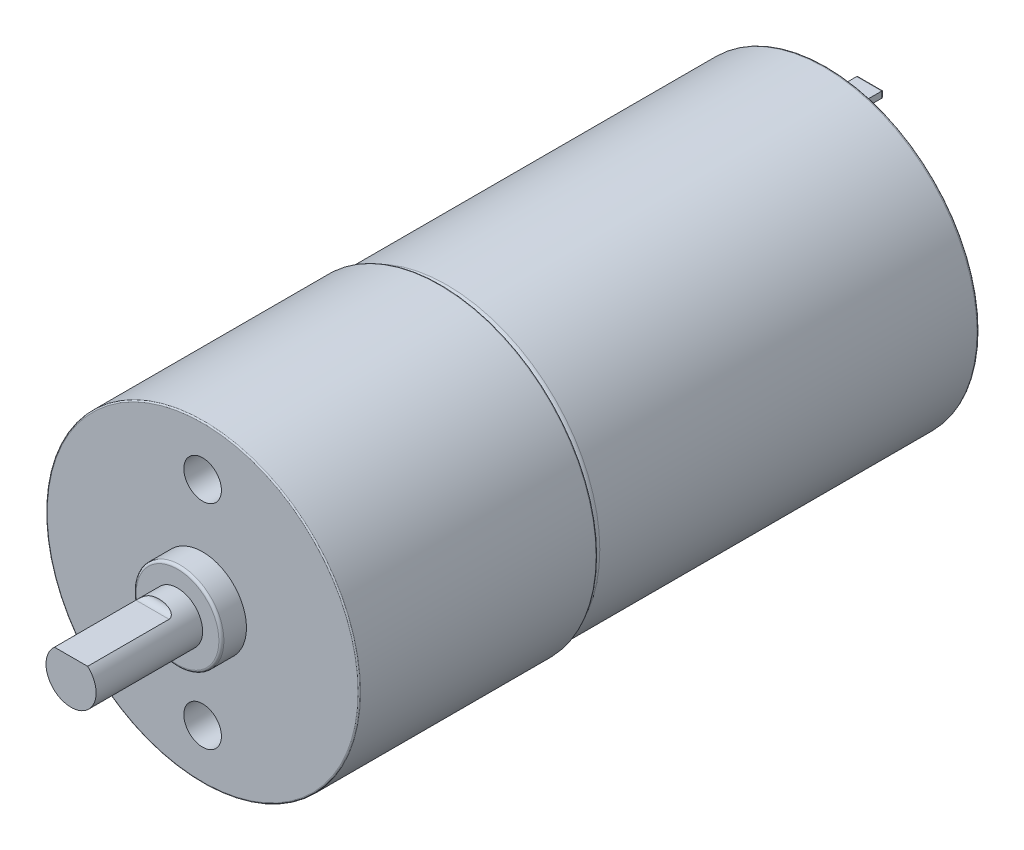
ISO-10303-21;
HEADER;
FILE_DESCRIPTION(('STEP AP214'),'2;1');
FILE_NAME('part.step','',(''),(''),'','','');
FILE_SCHEMA(('AUTOMOTIVE_DESIGN { 1 0 10303 214 1 1 1 1 }'));
ENDSEC;
DATA;
#1=APPLICATION_CONTEXT('core data for automotive mechanical design processes');
#2=APPLICATION_PROTOCOL_DEFINITION('international standard','automotive_design',2000,#1);
#3=PRODUCT_CONTEXT('',#1,'mechanical');
#4=PRODUCT('Part','Part','',(#3));
#5=PRODUCT_RELATED_PRODUCT_CATEGORY('part','',(#4));
#6=PRODUCT_DEFINITION_FORMATION('','',#4);
#7=PRODUCT_DEFINITION_CONTEXT('part definition',#1,'design');
#8=PRODUCT_DEFINITION('design','',#6,#7);
#9=PRODUCT_DEFINITION_SHAPE('','',#8);
#10=(LENGTH_UNIT() NAMED_UNIT(*) SI_UNIT(.MILLI.,.METRE.));
#11=(NAMED_UNIT(*) PLANE_ANGLE_UNIT() SI_UNIT($,.RADIAN.));
#12=(NAMED_UNIT(*) SI_UNIT($,.STERADIAN.) SOLID_ANGLE_UNIT());
#13=UNCERTAINTY_MEASURE_WITH_UNIT(LENGTH_MEASURE(1.E-05),#10,'distance_accuracy_value','');
#14=(GEOMETRIC_REPRESENTATION_CONTEXT(3) GLOBAL_UNCERTAINTY_ASSIGNED_CONTEXT((#13)) GLOBAL_UNIT_ASSIGNED_CONTEXT((#10,
#11,#12)) REPRESENTATION_CONTEXT('',''));
#15=CARTESIAN_POINT('',(0.,0.,0.));
#16=DIRECTION('',(0.,0.,1.));
#17=DIRECTION('',(1.,0.,0.));
#18=AXIS2_PLACEMENT_3D('',#15,#16,#17);
#19=CARTESIAN_POINT('',(0.,0.,0.));
#20=DIRECTION('',(0.,0.,1.));
#21=DIRECTION('',(1.,0.,0.));
#22=AXIS2_PLACEMENT_3D('',#19,#20,#21);
#23=PLANE('',#22);
#24=DIRECTION('',(0.,-1.,0.));
#25=VECTOR('',#24,1.);
#26=CARTESIAN_POINT('',(1.,8.75,0.));
#27=LINE('',#26,#25);
#28=CARTESIAN_POINT('',(1.,9.25,0.));
#29=VERTEX_POINT('',#28);
#30=CARTESIAN_POINT('',(1.,8.75,0.));
#31=VERTEX_POINT('',#30);
#32=EDGE_CURVE('E165',#29,#31,#27,.T.);
#33=ORIENTED_EDGE('',*,*,#32,.F.);
#34=DIRECTION('',(1.,0.,0.));
#35=VECTOR('',#34,1.);
#36=CARTESIAN_POINT('',(-1.,9.25,0.));
#37=LINE('',#36,#35);
#38=CARTESIAN_POINT('',(-1.,9.25,0.));
#39=VERTEX_POINT('',#38);
#40=EDGE_CURVE('E174',#39,#29,#37,.T.);
#41=ORIENTED_EDGE('',*,*,#40,.F.);
#42=DIRECTION('',(0.,1.,0.));
#43=VECTOR('',#42,1.);
#44=CARTESIAN_POINT('',(-1.,8.75,0.));
#45=LINE('',#44,#43);
#46=CARTESIAN_POINT('',(-1.,8.75,0.));
#47=VERTEX_POINT('',#46);
#48=EDGE_CURVE('E171',#47,#39,#45,.T.);
#49=ORIENTED_EDGE('',*,*,#48,.F.);
#50=DIRECTION('',(-1.,0.,0.));
#51=VECTOR('',#50,1.);
#52=CARTESIAN_POINT('',(-1.,8.75,0.));
#53=LINE('',#52,#51);
#54=EDGE_CURVE('E168',#31,#47,#53,.T.);
#55=ORIENTED_EDGE('',*,*,#54,.F.);
#56=EDGE_LOOP('',(#33,#41,#49,#55));
#57=FACE_BOUND('',#56,.T.);
#58=CARTESIAN_POINT('',(0.,0.,0.));
#59=DIRECTION('',(0.,0.,1.));
#60=DIRECTION('',(1.,0.,0.));
#61=AXIS2_PLACEMENT_3D('',#58,#59,#60);
#62=CIRCLE('',#61,12.);
#63=CARTESIAN_POINT('',(12.,0.,0.));
#64=VERTEX_POINT('',#63);
#65=EDGE_CURVE('E364',#64,#64,#62,.F.);
#66=ORIENTED_EDGE('',*,*,#65,.T.);
#67=EDGE_LOOP('',(#66));
#68=FACE_BOUND('',#67,.T.);
#69=CARTESIAN_POINT('',(0.,0.,0.));
#70=DIRECTION('',(0.,0.,1.));
#71=DIRECTION('',(1.,0.,0.));
#72=AXIS2_PLACEMENT_3D('',#69,#70,#71);
#73=CIRCLE('',#72,3.225);
#74=CARTESIAN_POINT('',(3.225,0.,0.));
#75=VERTEX_POINT('',#74);
#76=EDGE_CURVE('E219',#75,#75,#73,.F.);
#77=ORIENTED_EDGE('',*,*,#76,.F.);
#78=EDGE_LOOP('',(#77));
#79=FACE_BOUND('',#78,.T.);
#80=DIRECTION('',(0.,-1.,0.));
#81=VECTOR('',#80,1.);
#82=CARTESIAN_POINT('',(0.999999999999999,-9.25,0.));
#83=LINE('',#82,#81);
#84=CARTESIAN_POINT('',(0.999999999999999,-8.75,0.));
#85=VERTEX_POINT('',#84);
#86=CARTESIAN_POINT('',(0.999999999999999,-9.25,0.));
#87=VERTEX_POINT('',#86);
#88=EDGE_CURVE('E140',#85,#87,#83,.T.);
#89=ORIENTED_EDGE('',*,*,#88,.F.);
#90=DIRECTION('',(1.,0.,0.));
#91=VECTOR('',#90,1.);
#92=CARTESIAN_POINT('',(-1.,-8.75,0.));
#93=LINE('',#92,#91);
#94=CARTESIAN_POINT('',(-1.,-8.75,0.));
#95=VERTEX_POINT('',#94);
#96=EDGE_CURVE('E143',#95,#85,#93,.T.);
#97=ORIENTED_EDGE('',*,*,#96,.F.);
#98=DIRECTION('',(0.,1.,0.));
#99=VECTOR('',#98,1.);
#100=CARTESIAN_POINT('',(-1.,-9.25,0.));
#101=LINE('',#100,#99);
#102=CARTESIAN_POINT('',(-1.,-9.25,0.));
#103=VERTEX_POINT('',#102);
#104=EDGE_CURVE('E155',#103,#95,#101,.T.);
#105=ORIENTED_EDGE('',*,*,#104,.F.);
#106=DIRECTION('',(-1.,0.,0.));
#107=VECTOR('',#106,1.);
#108=CARTESIAN_POINT('',(-1.,-9.25,0.));
#109=LINE('',#108,#107);
#110=EDGE_CURVE('E151',#87,#103,#109,.T.);
#111=ORIENTED_EDGE('',*,*,#110,.F.);
#112=EDGE_LOOP('',(#89,#97,#105,#111));
#113=FACE_BOUND('',#112,.T.);
#114=ADVANCED_FACE('F34',(#57,#68,#79,#113),#23,.F.);
#115=CARTESIAN_POINT('',(0.,0.,30.8));
#116=DIRECTION('',(0.,0.,-1.));
#117=DIRECTION('',(-1.,0.,0.));
#118=AXIS2_PLACEMENT_3D('',#115,#116,#117);
#119=CYLINDRICAL_SURFACE('',#118,12.2);
#120=CARTESIAN_POINT('',(0.,0.,0.199999999999999));
#121=DIRECTION('',(0.,0.,1.));
#122=DIRECTION('',(1.,0.,0.));
#123=AXIS2_PLACEMENT_3D('',#120,#121,#122);
#124=CIRCLE('',#123,12.2);
#125=CARTESIAN_POINT('',(-12.2,0.,0.199999999999995));
#126=VERTEX_POINT('',#125);
#127=EDGE_CURVE('E356',#126,#126,#124,.T.);
#128=CARTESIAN_POINT('',(0.,0.,30.3));
#129=DIRECTION('',(0.,0.,1.));
#130=DIRECTION('',(1.,0.,0.));
#131=AXIS2_PLACEMENT_3D('',#128,#129,#130);
#132=CIRCLE('',#131,12.2);
#133=CARTESIAN_POINT('',(-12.2,0.,30.3));
#134=VERTEX_POINT('',#133);
#135=EDGE_CURVE('E216',#134,#134,#132,.F.);
#136=CARTESIAN_POINT('',(-12.2,0.,0.199999999999995));
#137=CARTESIAN_POINT('',(-12.2,0.,0.513541666666662));
#138=CARTESIAN_POINT('',(-12.2,0.,0.827083333333329));
#139=CARTESIAN_POINT('',(-12.2,0.,1.45416666666666));
#140=CARTESIAN_POINT('',(-12.2,0.,1.76770833333333));
#141=CARTESIAN_POINT('',(-12.2,0.,2.39479166666666));
#142=CARTESIAN_POINT('',(-12.2,0.,2.70833333333333));
#143=CARTESIAN_POINT('',(-12.2,0.,3.33541666666666));
#144=CARTESIAN_POINT('',(-12.2,0.,3.64895833333333));
#145=CARTESIAN_POINT('',(-12.2,0.,4.27604166666666));
#146=CARTESIAN_POINT('',(-12.2,0.,4.58958333333333));
#147=CARTESIAN_POINT('',(-12.2,0.,5.21666666666667));
#148=CARTESIAN_POINT('',(-12.2,0.,5.53020833333333));
#149=CARTESIAN_POINT('',(-12.2,0.,6.15729166666666));
#150=CARTESIAN_POINT('',(-12.2,0.,6.47083333333333));
#151=CARTESIAN_POINT('',(-12.2,0.,7.09791666666666));
#152=CARTESIAN_POINT('',(-12.2,0.,7.41145833333333));
#153=CARTESIAN_POINT('',(-12.2,0.,8.03854166666666));
#154=CARTESIAN_POINT('',(-12.2,0.,8.35208333333333));
#155=CARTESIAN_POINT('',(-12.2,0.,8.97916666666666));
#156=CARTESIAN_POINT('',(-12.2,0.,9.29270833333333));
#157=CARTESIAN_POINT('',(-12.2,0.,9.91979166666666));
#158=CARTESIAN_POINT('',(-12.2,0.,10.2333333333333));
#159=CARTESIAN_POINT('',(-12.2,0.,10.8604166666667));
#160=CARTESIAN_POINT('',(-12.2,0.,11.1739583333333));
#161=CARTESIAN_POINT('',(-12.2,0.,11.8010416666667));
#162=CARTESIAN_POINT('',(-12.2,0.,12.1145833333333));
#163=CARTESIAN_POINT('',(-12.2,0.,12.7416666666667));
#164=CARTESIAN_POINT('',(-12.2,0.,13.0552083333333));
#165=CARTESIAN_POINT('',(-12.2,0.,13.6822916666667));
#166=CARTESIAN_POINT('',(-12.2,0.,13.9958333333333));
#167=CARTESIAN_POINT('',(-12.2,0.,14.6229166666667));
#168=CARTESIAN_POINT('',(-12.2,0.,14.9364583333333));
#169=CARTESIAN_POINT('',(-12.2,0.,15.5635416666667));
#170=CARTESIAN_POINT('',(-12.2,0.,15.8770833333333));
#171=CARTESIAN_POINT('',(-12.2,0.,16.5041666666667));
#172=CARTESIAN_POINT('',(-12.2,0.,16.8177083333333));
#173=CARTESIAN_POINT('',(-12.2,0.,17.4447916666667));
#174=CARTESIAN_POINT('',(-12.2,0.,17.7583333333333));
#175=CARTESIAN_POINT('',(-12.2,0.,18.3854166666667));
#176=CARTESIAN_POINT('',(-12.2,0.,18.6989583333333));
#177=CARTESIAN_POINT('',(-12.2,0.,19.3260416666667));
#178=CARTESIAN_POINT('',(-12.2,0.,19.6395833333333));
#179=CARTESIAN_POINT('',(-12.2,0.,20.2666666666667));
#180=CARTESIAN_POINT('',(-12.2,0.,20.5802083333333));
#181=CARTESIAN_POINT('',(-12.2,0.,21.2072916666667));
#182=CARTESIAN_POINT('',(-12.2,0.,21.5208333333333));
#183=CARTESIAN_POINT('',(-12.2,0.,22.1479166666667));
#184=CARTESIAN_POINT('',(-12.2,0.,22.4614583333333));
#185=CARTESIAN_POINT('',(-12.2,0.,23.0885416666667));
#186=CARTESIAN_POINT('',(-12.2,0.,23.4020833333333));
#187=CARTESIAN_POINT('',(-12.2,0.,24.0291666666667));
#188=CARTESIAN_POINT('',(-12.2,0.,24.3427083333333));
#189=CARTESIAN_POINT('',(-12.2,0.,24.9697916666667));
#190=CARTESIAN_POINT('',(-12.2,0.,25.2833333333333));
#191=CARTESIAN_POINT('',(-12.2,0.,25.9104166666667));
#192=CARTESIAN_POINT('',(-12.2,0.,26.2239583333333));
#193=CARTESIAN_POINT('',(-12.2,0.,26.8510416666667));
#194=CARTESIAN_POINT('',(-12.2,0.,27.1645833333333));
#195=CARTESIAN_POINT('',(-12.2,0.,27.7916666666667));
#196=CARTESIAN_POINT('',(-12.2,0.,28.1052083333333));
#197=CARTESIAN_POINT('',(-12.2,0.,28.7322916666667));
#198=CARTESIAN_POINT('',(-12.2,0.,29.0458333333333));
#199=CARTESIAN_POINT('',(-12.2,0.,29.6729166666667));
#200=CARTESIAN_POINT('',(-12.2,0.,29.9864583333333));
#201=CARTESIAN_POINT('',(-12.2,0.,30.3));
#202=B_SPLINE_CURVE_WITH_KNOTS('',3,(#136,#137,#138,#139,#140,#141,#142,#143,#144,#145,#146,
#147,#148,#149,#150,#151,#152,#153,#154,#155,#156,#157,#158,#159,#160,#161,#162,#163,#164,#165,
#166,#167,#168,#169,#170,#171,#172,#173,#174,#175,#176,#177,#178,#179,#180,#181,#182,#183,#184,
#185,#186,#187,#188,#189,#190,#191,#192,#193,#194,#195,#196,#197,#198,#199,#200,#201),
.UNSPECIFIED.,.F.,.F.,(4,2,2,2,2,2,2,2,2,2,2,2,2,2,2,2,2,2,2,2,2,2,2,2,2,2,2,2,2,2,2,2,4),(0.,
0.940625,1.88125,2.821875,3.7625,4.703125,5.64375,6.584375,7.525,8.465625,9.40625,10.346875,
11.2875,12.228125,13.16875,14.109375,15.05,15.990625,16.93125,17.871875,18.8125,19.753125,
20.69375,21.634375,22.575,23.515625,24.45625,25.396875,26.3375,27.278125,28.21875,29.159375,
30.1),.UNSPECIFIED.);
#203=EDGE_CURVE('BSEAM307',#126,#134,#202,.T.);
#204=ORIENTED_EDGE('',*,*,#127,.T.);
#205=ORIENTED_EDGE('',*,*,#135,.T.);
#206=ORIENTED_EDGE('',*,*,#203,.T.);
#207=ORIENTED_EDGE('',*,*,#203,.F.);
#208=EDGE_LOOP('',(#204,#206,#205,#207));
#209=FACE_BOUND('',#208,.T.);
#210=ADVANCED_FACE('F307',(#209),#119,.T.);
#211=CARTESIAN_POINT('',(0.,0.,30.3));
#212=DIRECTION('',(0.,0.,1.));
#213=DIRECTION('',(1.,0.,0.));
#214=AXIS2_PLACEMENT_3D('',#211,#212,#213);
#215=TOROIDAL_SURFACE('',#214,11.7,0.5);
#216=ORIENTED_EDGE('',*,*,#135,.F.);
#217=EDGE_LOOP('',(#216));
#218=FACE_BOUND('',#217,.T.);
#219=CARTESIAN_POINT('',(0.,0.,30.8));
#220=DIRECTION('',(0.,0.,1.));
#221=DIRECTION('',(1.,0.,0.));
#222=AXIS2_PLACEMENT_3D('',#219,#220,#221);
#223=CIRCLE('',#222,11.7);
#224=CARTESIAN_POINT('',(11.7,0.,30.8));
#225=VERTEX_POINT('',#224);
#226=EDGE_CURVE('E213',#225,#225,#223,.T.);
#227=ORIENTED_EDGE('',*,*,#226,.F.);
#228=EDGE_LOOP('',(#227));
#229=FACE_BOUND('',#228,.T.);
#230=ADVANCED_FACE('F251',(#218,#229),#215,.T.);
#231=CARTESIAN_POINT('',(0.,0.,49.8));
#232=DIRECTION('',(0.,0.,-1.));
#233=DIRECTION('',(-1.,0.,0.));
#234=AXIS2_PLACEMENT_3D('',#231,#232,#233);
#235=CYLINDRICAL_SURFACE('',#234,12.5);
#236=CARTESIAN_POINT('',(0.,0.,49.7));
#237=DIRECTION('',(0.,0.,1.));
#238=DIRECTION('',(1.,0.,0.));
#239=AXIS2_PLACEMENT_3D('',#236,#237,#238);
#240=CIRCLE('',#239,12.5);
#241=CARTESIAN_POINT('',(12.5,0.,49.7));
#242=VERTEX_POINT('',#241);
#243=EDGE_CURVE('E376',#242,#242,#240,.F.);
#244=ORIENTED_EDGE('',*,*,#243,.T.);
#245=EDGE_LOOP('',(#244));
#246=FACE_BOUND('',#245,.T.);
#247=CARTESIAN_POINT('',(0.,0.,30.9));
#248=DIRECTION('',(0.,0.,1.));
#249=DIRECTION('',(1.,0.,0.));
#250=AXIS2_PLACEMENT_3D('',#247,#248,#249);
#251=CIRCLE('',#250,12.5);
#252=CARTESIAN_POINT('',(12.5,0.,30.9));
#253=VERTEX_POINT('',#252);
#254=EDGE_CURVE('E367',#253,#253,#251,.T.);
#255=ORIENTED_EDGE('',*,*,#254,.T.);
#256=EDGE_LOOP('',(#255));
#257=FACE_BOUND('',#256,.T.);
#258=ADVANCED_FACE('F317',(#246,#257),#235,.T.);
#259=CARTESIAN_POINT('',(0.,0.,49.8));
#260=DIRECTION('',(0.,0.,1.));
#261=DIRECTION('',(1.,0.,0.));
#262=AXIS2_PLACEMENT_3D('',#259,#260,#261);
#263=PLANE('',#262);
#264=CARTESIAN_POINT('',(0.,-8.5,49.8));
#265=DIRECTION('',(0.,0.,1.));
#266=DIRECTION('',(1.,0.,0.));
#267=AXIS2_PLACEMENT_3D('',#264,#265,#266);
#268=CIRCLE('',#267,1.5);
#269=CARTESIAN_POINT('',(1.5,-8.5,49.8));
#270=VERTEX_POINT('',#269);
#271=EDGE_CURVE('E185',#270,#270,#268,.T.);
#272=ORIENTED_EDGE('',*,*,#271,.F.);
#273=EDGE_LOOP('',(#272));
#274=FACE_BOUND('',#273,.T.);
#275=CARTESIAN_POINT('',(0.,8.5,49.8));
#276=DIRECTION('',(0.,0.,1.));
#277=DIRECTION('',(1.,0.,0.));
#278=AXIS2_PLACEMENT_3D('',#275,#276,#277);
#279=CIRCLE('',#278,1.5);
#280=CARTESIAN_POINT('',(1.5,8.5,49.8));
#281=VERTEX_POINT('',#280);
#282=EDGE_CURVE('E189',#281,#281,#279,.T.);
#283=ORIENTED_EDGE('',*,*,#282,.F.);
#284=EDGE_LOOP('',(#283));
#285=FACE_BOUND('',#284,.T.);
#286=CARTESIAN_POINT('',(0.,0.,49.8));
#287=DIRECTION('',(0.,0.,1.));
#288=DIRECTION('',(1.,0.,0.));
#289=AXIS2_PLACEMENT_3D('',#286,#287,#288);
#290=CIRCLE('',#289,12.4);
#291=CARTESIAN_POINT('',(12.4,0.,49.8));
#292=VERTEX_POINT('',#291);
#293=EDGE_CURVE('E373',#292,#292,#290,.T.);
#294=ORIENTED_EDGE('',*,*,#293,.T.);
#295=EDGE_LOOP('',(#294));
#296=FACE_BOUND('',#295,.T.);
#297=CARTESIAN_POINT('',(0.,0.,49.8));
#298=DIRECTION('',(0.,0.,1.));
#299=DIRECTION('',(1.,0.,0.));
#300=AXIS2_PLACEMENT_3D('',#297,#298,#299);
#301=CIRCLE('',#300,3.5);
#302=CARTESIAN_POINT('',(3.5,0.,49.8));
#303=VERTEX_POINT('',#302);
#304=EDGE_CURVE('E208',#303,#303,#301,.T.);
#305=ORIENTED_EDGE('',*,*,#304,.F.);
#306=EDGE_LOOP('',(#305));
#307=FACE_BOUND('',#306,.T.);
#308=ADVANCED_FACE('F320',(#274,#285,#296,#307),#263,.T.);
#309=CARTESIAN_POINT('',(0.,0.,30.8));
#310=DIRECTION('',(0.,0.,1.));
#311=DIRECTION('',(1.,0.,0.));
#312=AXIS2_PLACEMENT_3D('',#309,#310,#311);
#313=PLANE('',#312);
#314=CARTESIAN_POINT('',(0.,0.,30.8));
#315=DIRECTION('',(0.,0.,1.));
#316=DIRECTION('',(1.,0.,0.));
#317=AXIS2_PLACEMENT_3D('',#314,#315,#316);
#318=CIRCLE('',#317,12.4);
#319=CARTESIAN_POINT('',(12.4,0.,30.8));
#320=VERTEX_POINT('',#319);
#321=EDGE_CURVE('E370',#320,#320,#318,.F.);
#322=ORIENTED_EDGE('',*,*,#321,.T.);
#323=EDGE_LOOP('',(#322));
#324=FACE_BOUND('',#323,.T.);
#325=ORIENTED_EDGE('',*,*,#226,.T.);
#326=EDGE_LOOP('',(#325));
#327=FACE_BOUND('',#326,.T.);
#328=ADVANCED_FACE('F322',(#324,#327),#313,.F.);
#329=CARTESIAN_POINT('',(0.,0.,51.8));
#330=DIRECTION('',(0.,0.,-1.));
#331=DIRECTION('',(-1.,0.,0.));
#332=AXIS2_PLACEMENT_3D('',#329,#330,#331);
#333=CYLINDRICAL_SURFACE('',#332,3.5);
#334=CARTESIAN_POINT('',(0.,0.,51.6));
#335=DIRECTION('',(0.,0.,1.));
#336=DIRECTION('',(1.,0.,0.));
#337=AXIS2_PLACEMENT_3D('',#334,#335,#336);
#338=CIRCLE('',#337,3.5);
#339=CARTESIAN_POINT('',(3.5,0.,51.6));
#340=VERTEX_POINT('',#339);
#341=EDGE_CURVE('E353',#340,#340,#338,.F.);
#342=ORIENTED_EDGE('',*,*,#341,.T.);
#343=EDGE_LOOP('',(#342));
#344=FACE_BOUND('',#343,.T.);
#345=ORIENTED_EDGE('',*,*,#304,.T.);
#346=EDGE_LOOP('',(#345));
#347=FACE_BOUND('',#346,.T.);
#348=ADVANCED_FACE('F325',(#344,#347),#333,.T.);
#349=CARTESIAN_POINT('',(0.,0.,51.8));
#350=DIRECTION('',(0.,0.,1.));
#351=DIRECTION('',(1.,0.,0.));
#352=AXIS2_PLACEMENT_3D('',#349,#350,#351);
#353=PLANE('',#352);
#354=CARTESIAN_POINT('',(0.,0.,51.8));
#355=DIRECTION('',(0.,0.,1.));
#356=DIRECTION('',(1.,0.,0.));
#357=AXIS2_PLACEMENT_3D('',#354,#355,#356);
#358=CIRCLE('',#357,3.3);
#359=CARTESIAN_POINT('',(3.3,0.,51.8));
#360=VERTEX_POINT('',#359);
#361=EDGE_CURVE('E359',#360,#360,#358,.T.);
#362=ORIENTED_EDGE('',*,*,#361,.T.);
#363=EDGE_LOOP('',(#362));
#364=FACE_BOUND('',#363,.T.);
#365=CARTESIAN_POINT('',(0.,0.,51.8));
#366=DIRECTION('',(0.,0.,1.));
#367=DIRECTION('',(1.,0.,0.));
#368=AXIS2_PLACEMENT_3D('',#365,#366,#367);
#369=CIRCLE('',#368,2.);
#370=CARTESIAN_POINT('',(2.,0.,51.8));
#371=VERTEX_POINT('',#370);
#372=EDGE_CURVE('E203',#371,#371,#369,.T.);
#373=ORIENTED_EDGE('',*,*,#372,.F.);
#374=EDGE_LOOP('',(#373));
#375=FACE_BOUND('',#374,.T.);
#376=ADVANCED_FACE('F332',(#364,#375),#353,.T.);
#377=CARTESIAN_POINT('',(0.,0.,-1.7));
#378=DIRECTION('',(0.,0.,1.));
#379=DIRECTION('',(1.,0.,0.));
#380=AXIS2_PLACEMENT_3D('',#377,#378,#379);
#381=CYLINDRICAL_SURFACE('',#380,3.225);
#382=CARTESIAN_POINT('',(0.,0.,-1.4));
#383=DIRECTION('',(0.,0.,-1.));
#384=DIRECTION('',(-1.,0.,0.));
#385=AXIS2_PLACEMENT_3D('',#382,#383,#384);
#386=CIRCLE('',#385,3.225);
#387=CARTESIAN_POINT('',(-3.225,0.,-1.4));
#388=VERTEX_POINT('',#387);
#389=EDGE_CURVE('E352',#388,#388,#386,.F.);
#390=ORIENTED_EDGE('',*,*,#389,.T.);
#391=EDGE_LOOP('',(#390));
#392=FACE_BOUND('',#391,.T.);
#393=ORIENTED_EDGE('',*,*,#76,.T.);
#394=EDGE_LOOP('',(#393));
#395=FACE_BOUND('',#394,.T.);
#396=ADVANCED_FACE('F336',(#392,#395),#381,.T.);
#397=CARTESIAN_POINT('',(0.,0.,-1.7));
#398=DIRECTION('',(0.,0.,-1.));
#399=DIRECTION('',(-1.,0.,0.));
#400=AXIS2_PLACEMENT_3D('',#397,#398,#399);
#401=PLANE('',#400);
#402=CARTESIAN_POINT('',(0.,0.,-1.7));
#403=DIRECTION('',(0.,0.,-1.));
#404=DIRECTION('',(-1.,0.,0.));
#405=AXIS2_PLACEMENT_3D('',#402,#403,#404);
#406=CIRCLE('',#405,2.925);
#407=CARTESIAN_POINT('',(-2.925,0.,-1.7));
#408=VERTEX_POINT('',#407);
#409=EDGE_CURVE('E350',#408,#408,#406,.T.);
#410=ORIENTED_EDGE('',*,*,#409,.T.);
#411=EDGE_LOOP('',(#410));
#412=FACE_BOUND('',#411,.T.);
#413=ADVANCED_FACE('F339',(#412),#401,.T.);
#414=CARTESIAN_POINT('',(0.,0.,60.3));
#415=DIRECTION('',(0.,0.,-1.));
#416=DIRECTION('',(-1.,0.,0.));
#417=AXIS2_PLACEMENT_3D('',#414,#415,#416);
#418=CYLINDRICAL_SURFACE('',#417,2.);
#419=CARTESIAN_POINT('',(0.,0.,60.3));
#420=DIRECTION('',(0.,0.,1.));
#421=DIRECTION('',(1.,0.,0.));
#422=AXIS2_PLACEMENT_3D('',#419,#420,#421);
#423=CIRCLE('',#422,2.);
#424=CARTESIAN_POINT('',(-1.3228756555323,1.5,60.3));
#425=VERTEX_POINT('',#424);
#426=CARTESIAN_POINT('',(1.3228756555323,1.5,60.3));
#427=VERTEX_POINT('',#426);
#428=EDGE_CURVE('E205',#425,#427,#423,.T.);
#429=ORIENTED_EDGE('',*,*,#428,.F.);
#430=DIRECTION('',(0.,0.,1.));
#431=VECTOR('',#430,1.);
#432=CARTESIAN_POINT('',(-1.3228756555323,1.5,53.3));
#433=LINE('',#432,#431);
#434=CARTESIAN_POINT('',(-1.3228756555323,1.5,53.8));
#435=VERTEX_POINT('',#434);
#436=EDGE_CURVE('E200',#435,#425,#433,.T.);
#437=ORIENTED_EDGE('',*,*,#436,.F.);
#438=CARTESIAN_POINT('',(-1.3228756555323,1.5,53.8));
#439=CARTESIAN_POINT('',(-1.32290249554325,1.49996270606029,53.7791667315949));
#440=CARTESIAN_POINT('',(-1.32140212957211,1.50129978816585,53.758375735467));
#441=CARTESIAN_POINT('',(-1.31557763831657,1.50641322039939,53.7176617251242));
#442=CARTESIAN_POINT('',(-1.31127550355055,1.51017057183518,53.6977332296912));
#443=CARTESIAN_POINT('',(-1.30008296474914,1.51981407592862,53.6592231435477));
#444=CARTESIAN_POINT('',(-1.29319766301496,1.52569603119732,53.6406389832443));
#445=CARTESIAN_POINT('',(-1.27715517011938,1.53915083555006,53.6051172898566));
#446=CARTESIAN_POINT('',(-1.26799379639232,1.54672679498616,53.5881828690311));
#447=CARTESIAN_POINT('',(-1.24424694158101,1.5659352507262,53.5506556717046));
#448=CARTESIAN_POINT('',(-1.22888026060026,1.5780659357671,53.5308135526903));
#449=CARTESIAN_POINT('',(-1.19543436724803,1.60355292829531,53.4945106063299));
#450=CARTESIAN_POINT('',(-1.1773507132204,1.61691122851475,53.4780554222555));
#451=CARTESIAN_POINT('',(-1.12989939630501,1.65061355346302,53.4410808632268));
#452=CARTESIAN_POINT('',(-1.09928864144306,1.6712264849099,53.422414978214));
#453=CARTESIAN_POINT('',(-1.0349735453973,1.71180838948924,53.3905945258642));
#454=CARTESIAN_POINT('',(-1.00126314628604,1.73177599391625,53.3774510430377));
#455=CARTESIAN_POINT('',(-0.936712942531053,1.7674068793198,53.3569896907207));
#456=CARTESIAN_POINT('',(-0.906159383322034,1.78327580927139,53.349105299645));
#457=CARTESIAN_POINT('',(-0.843837816597498,1.81359919616298,53.3357497733859));
#458=CARTESIAN_POINT('',(-0.812068946788746,1.82805262187566,53.3302803875602));
#459=CARTESIAN_POINT('',(-0.715103418448153,1.86910516015979,53.316563630909));
#460=CARTESIAN_POINT('',(-0.648472947905406,1.89327140248486,53.3110684994363));
#461=CARTESIAN_POINT('',(-0.533493540646208,1.92816857753683,53.3049793012436));
#462=CARTESIAN_POINT('',(-0.485721481237839,1.94075179040353,53.3034047922928));
#463=CARTESIAN_POINT('',(-0.389324748217487,1.96236159421757,53.3012997819633));
#464=CARTESIAN_POINT('',(-0.340699710061064,1.97138662378789,53.3007697385026));
#465=CARTESIAN_POINT('',(-0.243505091363852,1.98572154796853,53.3001505658962));
#466=CARTESIAN_POINT('',(-0.194941872520537,1.99107480377463,53.3000562124136));
#467=CARTESIAN_POINT('',(-0.0975862636516997,1.99821426660851,53.30000114412));
#468=CARTESIAN_POINT('',(-0.0487940475334269,2.00000284375075,53.3000403404663));
#469=CARTESIAN_POINT('',(0.,2.,53.3));
#470=B_SPLINE_CURVE_WITH_KNOTS('',3,(#438,#439,#440,#441,#442,#443,#444,#445,#446,#447,#448,
#449,#450,#451,#452,#453,#454,#455,#456,#457,#458,#459,#460,#461,#462,#463,#464,#465,#466,#467,
#468,#469),.UNSPECIFIED.,.F.,.F.,(4,2,2,2,2,2,2,2,2,2,2,2,2,2,2,4),(0.,0.0623361213515323,
0.124188781572261,0.185919907474342,0.247765322113709,0.330925588519996,0.414223313529667,
0.537596290141987,0.661215730262541,0.767023269564857,0.872907327459004,1.08546090209827,
1.23362127654702,1.38184659352133,1.52828985178853,1.67463570906595),.UNSPECIFIED.);
#471=CARTESIAN_POINT('',(0.,2.,53.3));
#472=VERTEX_POINT('',#471);
#473=EDGE_CURVE('E233',#435,#472,#470,.T.);
#474=ORIENTED_EDGE('',*,*,#473,.T.);
#475=CARTESIAN_POINT('',(0.,2.,53.3));
#476=CARTESIAN_POINT('',(0.0277214994074883,1.99999996521892,53.300003160814));
#477=CARTESIAN_POINT('',(0.0554396855988818,1.99942354715943,53.2999995917166));
#478=CARTESIAN_POINT('',(0.110828337520304,1.99711932693701,53.3000063841451));
#479=CARTESIAN_POINT('',(0.138498802931801,1.99539151711823,53.3000167457635));
#480=CARTESIAN_POINT('',(0.221445582738737,1.98847732027611,53.3001098909154));
#481=CARTESIAN_POINT('',(0.276587673951735,1.9815601692915,53.3002548641052));
#482=CARTESIAN_POINT('',(0.38650299177489,1.96309583052268,53.3012777899694));
#483=CARTESIAN_POINT('',(0.441270401926249,1.95151450287656,53.3021612001388));
#484=CARTESIAN_POINT('',(0.549551550537827,1.92382701326223,53.30563909123));
#485=CARTESIAN_POINT('',(0.603066491399543,1.90772540161341,53.3082318549612));
#486=CARTESIAN_POINT('',(0.706658822598145,1.87177494084792,53.3163809202459));
#487=CARTESIAN_POINT('',(0.756791410367493,1.85206460582957,53.321838350164));
#488=CARTESIAN_POINT('',(0.854671011328554,1.80897198535894,53.3373620957461));
#489=CARTESIAN_POINT('',(0.902422712657079,1.78559732468401,53.3474189224318));
#490=CARTESIAN_POINT('',(0.98446065745252,1.7414123008308,53.3714917729622));
#491=CARTESIAN_POINT('',(1.0194209668387,1.72114550444624,53.3841758210046));
#492=CARTESIAN_POINT('',(1.08625210360712,1.6797574614909,53.4151477479525));
#493=CARTESIAN_POINT('',(1.11812954843951,1.6586381895228,53.4334232567075));
#494=CARTESIAN_POINT('',(1.16665410090004,1.6246414231238,53.4691307604824));
#495=CARTESIAN_POINT('',(1.18465253653303,1.61153419583203,53.4844974735047));
#496=CARTESIAN_POINT('',(1.21822668488763,1.58630436416556,53.518395311378));
#497=CARTESIAN_POINT('',(1.23380489230911,1.5741807521532,53.536923135943));
#498=CARTESIAN_POINT('',(1.25926050141169,1.5538593751693,53.5734807981708));
#499=CARTESIAN_POINT('',(1.26965940625499,1.54535008489931,53.5909706384682));
#500=CARTESIAN_POINT('',(1.28796132285253,1.53012974862329,53.6278962294533));
#501=CARTESIAN_POINT('',(1.29586971624669,1.52341483006188,53.6473276631785));
#502=CARTESIAN_POINT('',(1.30900046395838,1.51214961450599,53.6883538103289));
#503=CARTESIAN_POINT('',(1.31414150651585,1.50766511223057,53.7099938278133));
#504=CARTESIAN_POINT('',(1.31934935109212,1.50310420965845,53.7432334403093));
#505=CARTESIAN_POINT('',(1.32066822527187,1.50194459767766,53.7545071141078));
#506=CARTESIAN_POINT('',(1.32243222881828,1.50039115825993,53.7771843455788));
#507=CARTESIAN_POINT('',(1.32287661619495,1.49999798113503,53.7885880052993));
#508=CARTESIAN_POINT('',(1.3228756555323,1.5,53.8));
#509=B_SPLINE_CURVE_WITH_KNOTS('',3,(#475,#476,#477,#478,#479,#480,#481,#482,#483,#484,#485,
#486,#487,#488,#489,#490,#491,#492,#493,#494,#495,#496,#497,#498,#499,#500,#501,#502,#503,#504,
#505,#506,#507,#508),.UNSPECIFIED.,.F.,.F.,(4,2,2,2,2,2,2,2,2,2,2,2,2,2,2,2,4),(0.,
0.0831518881006715,0.166304329101573,0.332817378921308,0.500572054701925,0.66815846296581,
0.830308048990247,0.992124604180289,1.11884127424759,1.24527960800424,1.32619561396051,
1.40702765265176,1.47293108793841,1.53869112232152,1.60629038805136,1.64046615339948,
1.67467090393083),.UNSPECIFIED.);
#510=CARTESIAN_POINT('',(1.3228756555323,1.5,53.8));
#511=VERTEX_POINT('',#510);
#512=EDGE_CURVE('E225',#472,#511,#509,.T.);
#513=ORIENTED_EDGE('',*,*,#512,.T.);
#514=DIRECTION('',(0.,0.,1.));
#515=VECTOR('',#514,1.);
#516=CARTESIAN_POINT('',(1.3228756555323,1.5,53.3));
#517=LINE('',#516,#515);
#518=EDGE_CURVE('E201',#511,#427,#517,.T.);
#519=ORIENTED_EDGE('',*,*,#518,.T.);
#520=EDGE_LOOP('',(#429,#437,#474,#513,#519));
#521=FACE_BOUND('',#520,.T.);
#522=ORIENTED_EDGE('',*,*,#372,.T.);
#523=EDGE_LOOP('',(#522));
#524=FACE_BOUND('',#523,.T.);
#525=ADVANCED_FACE('F239',(#521,#524),#418,.T.);
#526=CARTESIAN_POINT('',(0.,0.,60.3));
#527=DIRECTION('',(0.,0.,1.));
#528=DIRECTION('',(1.,0.,0.));
#529=AXIS2_PLACEMENT_3D('',#526,#527,#528);
#530=PLANE('',#529);
#531=DIRECTION('',(1.,0.,0.));
#532=VECTOR('',#531,1.);
#533=CARTESIAN_POINT('',(-1.3228756555323,1.5,60.3));
#534=LINE('',#533,#532);
#535=EDGE_CURVE('E195',#425,#427,#534,.T.);
#536=ORIENTED_EDGE('',*,*,#535,.F.);
#537=ORIENTED_EDGE('',*,*,#428,.T.);
#538=EDGE_LOOP('',(#536,#537));
#539=FACE_BOUND('',#538,.T.);
#540=ADVANCED_FACE('F346',(#539),#530,.T.);
#541=CARTESIAN_POINT('',(-1.3228756555323,1.5,53.3));
#542=DIRECTION('',(0.,-1.,0.));
#543=DIRECTION('',(1.,0.,0.));
#544=AXIS2_PLACEMENT_3D('',#541,#542,#543);
#545=PLANE('',#544);
#546=ORIENTED_EDGE('',*,*,#518,.F.);
#547=DIRECTION('',(1.,0.,0.));
#548=VECTOR('',#547,1.);
#549=CARTESIAN_POINT('',(-1.3228756555323,1.5,53.8));
#550=LINE('',#549,#548);
#551=EDGE_CURVE('E222',#511,#435,#550,.F.);
#552=ORIENTED_EDGE('',*,*,#551,.T.);
#553=ORIENTED_EDGE('',*,*,#436,.T.);
#554=ORIENTED_EDGE('',*,*,#535,.T.);
#555=EDGE_LOOP('',(#546,#552,#553,#554));
#556=FACE_BOUND('',#555,.T.);
#557=ADVANCED_FACE('F249',(#556),#545,.F.);
#558=CARTESIAN_POINT('',(0.,2.,53.8));
#559=DIRECTION('',(1.,0.,0.));
#560=DIRECTION('',(0.,1.,0.));
#561=AXIS2_PLACEMENT_3D('',#558,#559,#560);
#562=CYLINDRICAL_SURFACE('',#561,0.5);
#563=ORIENTED_EDGE('',*,*,#473,.F.);
#564=ORIENTED_EDGE('',*,*,#551,.F.);
#565=ORIENTED_EDGE('',*,*,#512,.F.);
#566=EDGE_LOOP('',(#563,#564,#565));
#567=FACE_BOUND('',#566,.T.);
#568=ADVANCED_FACE('F243',(#567),#562,.F.);
#569=CARTESIAN_POINT('',(0.,0.,51.6));
#570=DIRECTION('',(0.,0.,1.));
#571=DIRECTION('',(1.,0.,0.));
#572=AXIS2_PLACEMENT_3D('',#569,#570,#571);
#573=TOROIDAL_SURFACE('',#572,3.3,0.2);
#574=ORIENTED_EDGE('',*,*,#341,.F.);
#575=EDGE_LOOP('',(#574));
#576=FACE_BOUND('',#575,.T.);
#577=ORIENTED_EDGE('',*,*,#361,.F.);
#578=EDGE_LOOP('',(#577));
#579=FACE_BOUND('',#578,.T.);
#580=ADVANCED_FACE('F248',(#576,#579),#573,.T.);
#581=CARTESIAN_POINT('',(0.,0.,-1.4));
#582=DIRECTION('',(0.,0.,-1.));
#583=DIRECTION('',(-1.,0.,0.));
#584=AXIS2_PLACEMENT_3D('',#581,#582,#583);
#585=TOROIDAL_SURFACE('',#584,2.925,0.3);
#586=ORIENTED_EDGE('',*,*,#389,.F.);
#587=EDGE_LOOP('',(#586));
#588=FACE_BOUND('',#587,.T.);
#589=ORIENTED_EDGE('',*,*,#409,.F.);
#590=EDGE_LOOP('',(#589));
#591=FACE_BOUND('',#590,.T.);
#592=ADVANCED_FACE('F256',(#588,#591),#585,.T.);
#593=CARTESIAN_POINT('',(0.,0.,0.199999999999999));
#594=DIRECTION('',(0.,0.,1.));
#595=DIRECTION('',(1.,0.,0.));
#596=AXIS2_PLACEMENT_3D('',#593,#594,#595);
#597=TOROIDAL_SURFACE('',#596,12.,0.2);
#598=ORIENTED_EDGE('',*,*,#65,.F.);
#599=EDGE_LOOP('',(#598));
#600=FACE_BOUND('',#599,.T.);
#601=ORIENTED_EDGE('',*,*,#127,.F.);
#602=EDGE_LOOP('',(#601));
#603=FACE_BOUND('',#602,.T.);
#604=ADVANCED_FACE('F260',(#600,#603),#597,.T.);
#605=CARTESIAN_POINT('',(0.,0.,30.9));
#606=DIRECTION('',(0.,0.,1.));
#607=DIRECTION('',(1.,0.,0.));
#608=AXIS2_PLACEMENT_3D('',#605,#606,#607);
#609=TOROIDAL_SURFACE('',#608,12.4,0.1);
#610=ORIENTED_EDGE('',*,*,#321,.F.);
#611=EDGE_LOOP('',(#610));
#612=FACE_BOUND('',#611,.T.);
#613=ORIENTED_EDGE('',*,*,#254,.F.);
#614=EDGE_LOOP('',(#613));
#615=FACE_BOUND('',#614,.T.);
#616=ADVANCED_FACE('F264',(#612,#615),#609,.T.);
#617=CARTESIAN_POINT('',(0.,0.,49.7));
#618=DIRECTION('',(0.,0.,1.));
#619=DIRECTION('',(1.,0.,0.));
#620=AXIS2_PLACEMENT_3D('',#617,#618,#619);
#621=TOROIDAL_SURFACE('',#620,12.4,0.1);
#622=ORIENTED_EDGE('',*,*,#243,.F.);
#623=EDGE_LOOP('',(#622));
#624=FACE_BOUND('',#623,.T.);
#625=ORIENTED_EDGE('',*,*,#293,.F.);
#626=EDGE_LOOP('',(#625));
#627=FACE_BOUND('',#626,.T.);
#628=ADVANCED_FACE('F268',(#624,#627),#621,.T.);
#629=CARTESIAN_POINT('',(0.,8.5,46.3));
#630=DIRECTION('',(0.,0.,1.));
#631=DIRECTION('',(1.,0.,0.));
#632=AXIS2_PLACEMENT_3D('',#629,#630,#631);
#633=CYLINDRICAL_SURFACE('',#632,1.5);
#634=CARTESIAN_POINT('',(0.,8.5,46.3));
#635=DIRECTION('',(0.,0.,1.));
#636=DIRECTION('',(1.,0.,0.));
#637=AXIS2_PLACEMENT_3D('',#634,#635,#636);
#638=CIRCLE('',#637,1.5);
#639=CARTESIAN_POINT('',(1.5,8.5,46.3));
#640=VERTEX_POINT('',#639);
#641=EDGE_CURVE('E192',#640,#640,#638,.T.);
#642=ORIENTED_EDGE('',*,*,#641,.F.);
#643=EDGE_LOOP('',(#642));
#644=FACE_BOUND('',#643,.T.);
#645=ORIENTED_EDGE('',*,*,#282,.T.);
#646=EDGE_LOOP('',(#645));
#647=FACE_BOUND('',#646,.T.);
#648=ADVANCED_FACE('F272',(#644,#647),#633,.F.);
#649=CARTESIAN_POINT('',(0.,0.,46.3));
#650=DIRECTION('',(0.,0.,1.));
#651=DIRECTION('',(1.,0.,0.));
#652=AXIS2_PLACEMENT_3D('',#649,#650,#651);
#653=PLANE('',#652);
#654=ORIENTED_EDGE('',*,*,#641,.T.);
#655=EDGE_LOOP('',(#654));
#656=FACE_BOUND('',#655,.T.);
#657=ADVANCED_FACE('F481',(#656),#653,.T.);
#658=CARTESIAN_POINT('',(0.,-8.5,46.3));
#659=DIRECTION('',(0.,0.,1.));
#660=DIRECTION('',(1.,0.,0.));
#661=AXIS2_PLACEMENT_3D('',#658,#659,#660);
#662=CYLINDRICAL_SURFACE('',#661,1.5);
#663=CARTESIAN_POINT('',(0.,-8.5,46.3));
#664=DIRECTION('',(0.,0.,1.));
#665=DIRECTION('',(1.,0.,0.));
#666=AXIS2_PLACEMENT_3D('',#663,#664,#665);
#667=CIRCLE('',#666,1.5);
#668=CARTESIAN_POINT('',(1.5,-8.5,46.3));
#669=VERTEX_POINT('',#668);
#670=EDGE_CURVE('E186',#669,#669,#667,.T.);
#671=ORIENTED_EDGE('',*,*,#670,.F.);
#672=EDGE_LOOP('',(#671));
#673=FACE_BOUND('',#672,.T.);
#674=ORIENTED_EDGE('',*,*,#271,.T.);
#675=EDGE_LOOP('',(#674));
#676=FACE_BOUND('',#675,.T.);
#677=ADVANCED_FACE('F477',(#673,#676),#662,.F.);
#678=CARTESIAN_POINT('',(0.,0.,46.3));
#679=DIRECTION('',(0.,0.,1.));
#680=DIRECTION('',(1.,0.,0.));
#681=AXIS2_PLACEMENT_3D('',#678,#679,#680);
#682=PLANE('',#681);
#683=ORIENTED_EDGE('',*,*,#670,.T.);
#684=EDGE_LOOP('',(#683));
#685=FACE_BOUND('',#684,.T.);
#686=ADVANCED_FACE('F473',(#685),#682,.T.);
#687=CARTESIAN_POINT('',(1.,8.75,-3.5));
#688=DIRECTION('',(-1.,0.,0.));
#689=DIRECTION('',(0.,0.,1.));
#690=AXIS2_PLACEMENT_3D('',#687,#688,#689);
#691=PLANE('',#690);
#692=DIRECTION('',(0.,0.,1.));
#693=VECTOR('',#692,1.);
#694=CARTESIAN_POINT('',(1.,8.75,-3.5));
#695=LINE('',#694,#693);
#696=CARTESIAN_POINT('',(1.,8.75,-3.4));
#697=VERTEX_POINT('',#696);
#698=EDGE_CURVE('E183',#697,#31,#695,.T.);
#699=ORIENTED_EDGE('',*,*,#698,.F.);
#700=DIRECTION('',(0.,-1.,0.));
#701=VECTOR('',#700,1.);
#702=CARTESIAN_POINT('',(1.,9.25,-3.4));
#703=LINE('',#702,#701);
#704=CARTESIAN_POINT('',(1.,9.25,-3.4));
#705=VERTEX_POINT('',#704);
#706=EDGE_CURVE('E395',#697,#705,#703,.F.);
#707=ORIENTED_EDGE('',*,*,#706,.T.);
#708=DIRECTION('',(0.,0.,1.));
#709=VECTOR('',#708,1.);
#710=CARTESIAN_POINT('',(1.,9.25,-3.5));
#711=LINE('',#710,#709);
#712=EDGE_CURVE('E177',#705,#29,#711,.T.);
#713=ORIENTED_EDGE('',*,*,#712,.T.);
#714=ORIENTED_EDGE('',*,*,#32,.T.);
#715=EDGE_LOOP('',(#699,#707,#713,#714));
#716=FACE_BOUND('',#715,.T.);
#717=ADVANCED_FACE('F469',(#716),#691,.F.);
#718=CARTESIAN_POINT('',(-1.,8.75,-3.5));
#719=DIRECTION('',(0.,1.,0.));
#720=DIRECTION('',(0.,0.,1.));
#721=AXIS2_PLACEMENT_3D('',#718,#719,#720);
#722=PLANE('',#721);
#723=DIRECTION('',(0.,0.,1.));
#724=VECTOR('',#723,1.);
#725=CARTESIAN_POINT('',(-1.,8.75,-3.5));
#726=LINE('',#725,#724);
#727=CARTESIAN_POINT('',(-1.,8.75,-3.4));
#728=VERTEX_POINT('',#727);
#729=EDGE_CURVE('E181',#728,#47,#726,.T.);
#730=ORIENTED_EDGE('',*,*,#729,.F.);
#731=DIRECTION('',(-1.,0.,0.));
#732=VECTOR('',#731,1.);
#733=CARTESIAN_POINT('',(1.,8.75,-3.4));
#734=LINE('',#733,#732);
#735=EDGE_CURVE('E388',#728,#697,#734,.F.);
#736=ORIENTED_EDGE('',*,*,#735,.T.);
#737=ORIENTED_EDGE('',*,*,#698,.T.);
#738=ORIENTED_EDGE('',*,*,#54,.T.);
#739=EDGE_LOOP('',(#730,#736,#737,#738));
#740=FACE_BOUND('',#739,.T.);
#741=ADVANCED_FACE('F465',(#740),#722,.F.);
#742=CARTESIAN_POINT('',(-1.,8.75,-3.5));
#743=DIRECTION('',(1.,0.,0.));
#744=DIRECTION('',(0.,0.,-1.));
#745=AXIS2_PLACEMENT_3D('',#742,#743,#744);
#746=PLANE('',#745);
#747=DIRECTION('',(0.,0.,1.));
#748=VECTOR('',#747,1.);
#749=CARTESIAN_POINT('',(-1.,9.25,-3.5));
#750=LINE('',#749,#748);
#751=CARTESIAN_POINT('',(-1.,9.25,-3.4));
#752=VERTEX_POINT('',#751);
#753=EDGE_CURVE('E179',#752,#39,#750,.T.);
#754=ORIENTED_EDGE('',*,*,#753,.F.);
#755=DIRECTION('',(0.,1.,0.));
#756=VECTOR('',#755,1.);
#757=CARTESIAN_POINT('',(-1.,8.75,-3.4));
#758=LINE('',#757,#756);
#759=EDGE_CURVE('E393',#752,#728,#758,.F.);
#760=ORIENTED_EDGE('',*,*,#759,.T.);
#761=ORIENTED_EDGE('',*,*,#729,.T.);
#762=ORIENTED_EDGE('',*,*,#48,.T.);
#763=EDGE_LOOP('',(#754,#760,#761,#762));
#764=FACE_BOUND('',#763,.T.);
#765=ADVANCED_FACE('F461',(#764),#746,.F.);
#766=CARTESIAN_POINT('',(-1.,9.25,-3.5));
#767=DIRECTION('',(0.,-1.,0.));
#768=DIRECTION('',(0.,0.,-1.));
#769=AXIS2_PLACEMENT_3D('',#766,#767,#768);
#770=PLANE('',#769);
#771=ORIENTED_EDGE('',*,*,#712,.F.);
#772=DIRECTION('',(1.,0.,0.));
#773=VECTOR('',#772,1.);
#774=CARTESIAN_POINT('',(-1.,9.25,-3.4));
#775=LINE('',#774,#773);
#776=EDGE_CURVE('E391',#705,#752,#775,.F.);
#777=ORIENTED_EDGE('',*,*,#776,.T.);
#778=ORIENTED_EDGE('',*,*,#753,.T.);
#779=ORIENTED_EDGE('',*,*,#40,.T.);
#780=EDGE_LOOP('',(#771,#777,#778,#779));
#781=FACE_BOUND('',#780,.T.);
#782=ADVANCED_FACE('F457',(#781),#770,.F.);
#783=CARTESIAN_POINT('',(0.,0.,-3.5));
#784=DIRECTION('',(0.,0.,-1.));
#785=DIRECTION('',(-1.,0.,0.));
#786=AXIS2_PLACEMENT_3D('',#783,#784,#785);
#787=PLANE('',#786);
#788=DIRECTION('',(-1.,0.,0.));
#789=VECTOR('',#788,1.);
#790=CARTESIAN_POINT('',(-1.,8.85,-3.5));
#791=LINE('',#790,#789);
#792=CARTESIAN_POINT('',(0.9,8.85,-3.5));
#793=VERTEX_POINT('',#792);
#794=CARTESIAN_POINT('',(-0.9,8.85,-3.5));
#795=VERTEX_POINT('',#794);
#796=EDGE_CURVE('E383',#793,#795,#791,.T.);
#797=ORIENTED_EDGE('',*,*,#796,.T.);
#798=DIRECTION('',(0.,1.,0.));
#799=VECTOR('',#798,1.);
#800=CARTESIAN_POINT('',(-0.9,9.25,-3.5));
#801=LINE('',#800,#799);
#802=CARTESIAN_POINT('',(-0.9,9.15,-3.5));
#803=VERTEX_POINT('',#802);
#804=EDGE_CURVE('E386',#795,#803,#801,.T.);
#805=ORIENTED_EDGE('',*,*,#804,.T.);
#806=DIRECTION('',(1.,0.,0.));
#807=VECTOR('',#806,1.);
#808=CARTESIAN_POINT('',(1.,9.15,-3.5));
#809=LINE('',#808,#807);
#810=CARTESIAN_POINT('',(0.9,9.15,-3.5));
#811=VERTEX_POINT('',#810);
#812=EDGE_CURVE('E381',#803,#811,#809,.T.);
#813=ORIENTED_EDGE('',*,*,#812,.T.);
#814=DIRECTION('',(0.,-1.,0.));
#815=VECTOR('',#814,1.);
#816=CARTESIAN_POINT('',(0.9,8.75,-3.5));
#817=LINE('',#816,#815);
#818=EDGE_CURVE('E379',#811,#793,#817,.T.);
#819=ORIENTED_EDGE('',*,*,#818,.T.);
#820=EDGE_LOOP('',(#797,#805,#813,#819));
#821=FACE_BOUND('',#820,.T.);
#822=ADVANCED_FACE('F454',(#821),#787,.T.);
#823=CARTESIAN_POINT('',(0.999999999999999,-9.25,-3.5));
#824=DIRECTION('',(-1.,0.,0.));
#825=DIRECTION('',(0.,0.,1.));
#826=AXIS2_PLACEMENT_3D('',#823,#824,#825);
#827=PLANE('',#826);
#828=DIRECTION('',(0.,0.,1.));
#829=VECTOR('',#828,1.);
#830=CARTESIAN_POINT('',(0.999999999999999,-9.25,-3.5));
#831=LINE('',#830,#829);
#832=CARTESIAN_POINT('',(0.999999999999999,-9.25,-3.4));
#833=VERTEX_POINT('',#832);
#834=EDGE_CURVE('E163',#833,#87,#831,.T.);
#835=ORIENTED_EDGE('',*,*,#834,.F.);
#836=DIRECTION('',(0.,-1.,0.));
#837=VECTOR('',#836,1.);
#838=CARTESIAN_POINT('',(0.999999999999999,-8.75,-3.4));
#839=LINE('',#838,#837);
#840=CARTESIAN_POINT('',(0.999999999999999,-8.75,-3.4));
#841=VERTEX_POINT('',#840);
#842=EDGE_CURVE('E11',#833,#841,#839,.F.);
#843=ORIENTED_EDGE('',*,*,#842,.T.);
#844=DIRECTION('',(0.,0.,1.));
#845=VECTOR('',#844,1.);
#846=CARTESIAN_POINT('',(0.999999999999999,-8.75,-3.5));
#847=LINE('',#846,#845);
#848=EDGE_CURVE('E137',#841,#85,#847,.T.);
#849=ORIENTED_EDGE('',*,*,#848,.T.);
#850=ORIENTED_EDGE('',*,*,#88,.T.);
#851=EDGE_LOOP('',(#835,#843,#849,#850));
#852=FACE_BOUND('',#851,.T.);
#853=ADVANCED_FACE('F139',(#852),#827,.F.);
#854=CARTESIAN_POINT('',(-1.,-9.25,-3.5));
#855=DIRECTION('',(0.,1.,0.));
#856=DIRECTION('',(0.,0.,1.));
#857=AXIS2_PLACEMENT_3D('',#854,#855,#856);
#858=PLANE('',#857);
#859=DIRECTION('',(0.,0.,1.));
#860=VECTOR('',#859,1.);
#861=CARTESIAN_POINT('',(-1.,-9.25,-3.5));
#862=LINE('',#861,#860);
#863=CARTESIAN_POINT('',(-1.,-9.25,-3.4));
#864=VERTEX_POINT('',#863);
#865=EDGE_CURVE('E161',#864,#103,#862,.T.);
#866=ORIENTED_EDGE('',*,*,#865,.F.);
#867=DIRECTION('',(-1.,0.,0.));
#868=VECTOR('',#867,1.);
#869=CARTESIAN_POINT('',(0.999999999999999,-9.25,-3.4));
#870=LINE('',#869,#868);
#871=EDGE_CURVE('E406',#864,#833,#870,.F.);
#872=ORIENTED_EDGE('',*,*,#871,.T.);
#873=ORIENTED_EDGE('',*,*,#834,.T.);
#874=ORIENTED_EDGE('',*,*,#110,.T.);
#875=EDGE_LOOP('',(#866,#872,#873,#874));
#876=FACE_BOUND('',#875,.T.);
#877=ADVANCED_FACE('F438',(#876),#858,.F.);
#878=CARTESIAN_POINT('',(-1.,-9.25,-3.5));
#879=DIRECTION('',(1.,0.,0.));
#880=DIRECTION('',(0.,0.,-1.));
#881=AXIS2_PLACEMENT_3D('',#878,#879,#880);
#882=PLANE('',#881);
#883=DIRECTION('',(0.,0.,1.));
#884=VECTOR('',#883,1.);
#885=CARTESIAN_POINT('',(-1.,-8.75,-3.5));
#886=LINE('',#885,#884);
#887=CARTESIAN_POINT('',(-1.,-8.75,-3.4));
#888=VERTEX_POINT('',#887);
#889=EDGE_CURVE('E142',#888,#95,#886,.T.);
#890=ORIENTED_EDGE('',*,*,#889,.F.);
#891=DIRECTION('',(0.,1.,0.));
#892=VECTOR('',#891,1.);
#893=CARTESIAN_POINT('',(-1.,-9.25,-3.4));
#894=LINE('',#893,#892);
#895=EDGE_CURVE('E43',#888,#864,#894,.F.);
#896=ORIENTED_EDGE('',*,*,#895,.T.);
#897=ORIENTED_EDGE('',*,*,#865,.T.);
#898=ORIENTED_EDGE('',*,*,#104,.T.);
#899=EDGE_LOOP('',(#890,#896,#897,#898));
#900=FACE_BOUND('',#899,.T.);
#901=ADVANCED_FACE('F435',(#900),#882,.F.);
#902=CARTESIAN_POINT('',(-1.,-8.75,-3.5));
#903=DIRECTION('',(0.,-1.,0.));
#904=DIRECTION('',(0.,0.,-1.));
#905=AXIS2_PLACEMENT_3D('',#902,#903,#904);
#906=PLANE('',#905);
#907=ORIENTED_EDGE('',*,*,#848,.F.);
#908=DIRECTION('',(1.,0.,0.));
#909=VECTOR('',#908,1.);
#910=CARTESIAN_POINT('',(-1.,-8.75,-3.4));
#911=LINE('',#910,#909);
#912=EDGE_CURVE('E51',#841,#888,#911,.F.);
#913=ORIENTED_EDGE('',*,*,#912,.T.);
#914=ORIENTED_EDGE('',*,*,#889,.T.);
#915=ORIENTED_EDGE('',*,*,#96,.T.);
#916=EDGE_LOOP('',(#907,#913,#914,#915));
#917=FACE_BOUND('',#916,.T.);
#918=ADVANCED_FACE('F154',(#917),#906,.F.);
#919=CARTESIAN_POINT('',(0.,0.,-3.5));
#920=DIRECTION('',(0.,0.,-1.));
#921=DIRECTION('',(-1.,0.,0.));
#922=AXIS2_PLACEMENT_3D('',#919,#920,#921);
#923=PLANE('',#922);
#924=DIRECTION('',(-1.,0.,0.));
#925=VECTOR('',#924,1.);
#926=CARTESIAN_POINT('',(-1.,-9.15,-3.5));
#927=LINE('',#926,#925);
#928=CARTESIAN_POINT('',(0.899999999999999,-9.15,-3.5));
#929=VERTEX_POINT('',#928);
#930=CARTESIAN_POINT('',(-0.900000000000001,-9.15,-3.5));
#931=VERTEX_POINT('',#930);
#932=EDGE_CURVE('E401',#929,#931,#927,.T.);
#933=ORIENTED_EDGE('',*,*,#932,.T.);
#934=DIRECTION('',(0.,1.,0.));
#935=VECTOR('',#934,1.);
#936=CARTESIAN_POINT('',(-0.900000000000001,-8.75,-3.5));
#937=LINE('',#936,#935);
#938=CARTESIAN_POINT('',(-0.900000000000001,-8.85,-3.5));
#939=VERTEX_POINT('',#938);
#940=EDGE_CURVE('E404',#931,#939,#937,.T.);
#941=ORIENTED_EDGE('',*,*,#940,.T.);
#942=DIRECTION('',(1.,0.,0.));
#943=VECTOR('',#942,1.);
#944=CARTESIAN_POINT('',(0.999999999999999,-8.85,-3.5));
#945=LINE('',#944,#943);
#946=CARTESIAN_POINT('',(0.899999999999999,-8.85,-3.5));
#947=VERTEX_POINT('',#946);
#948=EDGE_CURVE('E399',#939,#947,#945,.T.);
#949=ORIENTED_EDGE('',*,*,#948,.T.);
#950=DIRECTION('',(0.,-1.,0.));
#951=VECTOR('',#950,1.);
#952=CARTESIAN_POINT('',(0.899999999999999,-9.25,-3.5));
#953=LINE('',#952,#951);
#954=EDGE_CURVE('E397',#947,#929,#953,.T.);
#955=ORIENTED_EDGE('',*,*,#954,.T.);
#956=EDGE_LOOP('',(#933,#941,#949,#955));
#957=FACE_BOUND('',#956,.T.);
#958=ADVANCED_FACE('F289',(#957),#923,.T.);
#959=CARTESIAN_POINT('',(0.,9.15,-3.4));
#960=DIRECTION('',(-1.,0.,0.));
#961=DIRECTION('',(0.,0.,1.));
#962=AXIS2_PLACEMENT_3D('',#959,#960,#961);
#963=CYLINDRICAL_SURFACE('',#962,0.1);
#964=CARTESIAN_POINT('',(-0.9,9.15,-3.4));
#965=DIRECTION('',(-0.707106781186547,-0.707106781186547,0.));
#966=DIRECTION('',(0.707106781186547,-0.707106781186547,0.));
#967=AXIS2_PLACEMENT_3D('',#964,#965,#966);
#968=ELLIPSE('',#967,0.14142135623731,0.1);
#969=EDGE_CURVE('E415',#752,#803,#968,.T.);
#970=ORIENTED_EDGE('',*,*,#969,.F.);
#971=ORIENTED_EDGE('',*,*,#776,.F.);
#972=CARTESIAN_POINT('',(0.9,9.15,-3.4));
#973=DIRECTION('',(-0.707106781186547,0.707106781186547,0.));
#974=DIRECTION('',(0.707106781186547,0.707106781186547,0.));
#975=AXIS2_PLACEMENT_3D('',#972,#973,#974);
#976=ELLIPSE('',#975,0.14142135623731,0.1);
#977=EDGE_CURVE('E152',#811,#705,#976,.F.);
#978=ORIENTED_EDGE('',*,*,#977,.F.);
#979=ORIENTED_EDGE('',*,*,#812,.F.);
#980=EDGE_LOOP('',(#970,#971,#978,#979));
#981=FACE_BOUND('',#980,.T.);
#982=ADVANCED_FACE('F285',(#981),#963,.T.);
#983=CARTESIAN_POINT('',(0.9,0.,-3.4));
#984=DIRECTION('',(0.,1.,0.));
#985=DIRECTION('',(0.,0.,1.));
#986=AXIS2_PLACEMENT_3D('',#983,#984,#985);
#987=CYLINDRICAL_SURFACE('',#986,0.1);
#988=ORIENTED_EDGE('',*,*,#977,.T.);
#989=ORIENTED_EDGE('',*,*,#706,.F.);
#990=CARTESIAN_POINT('',(0.9,8.85,-3.4));
#991=DIRECTION('',(0.707106781186547,0.707106781186547,0.));
#992=DIRECTION('',(-0.707106781186547,0.707106781186547,0.));
#993=AXIS2_PLACEMENT_3D('',#990,#991,#992);
#994=ELLIPSE('',#993,0.14142135623731,0.1);
#995=EDGE_CURVE('E413',#793,#697,#994,.F.);
#996=ORIENTED_EDGE('',*,*,#995,.F.);
#997=ORIENTED_EDGE('',*,*,#818,.F.);
#998=EDGE_LOOP('',(#988,#989,#996,#997));
#999=FACE_BOUND('',#998,.T.);
#1000=ADVANCED_FACE('F281',(#999),#987,.T.);
#1001=CARTESIAN_POINT('',(-0.9,0.,-3.4));
#1002=DIRECTION('',(0.,-1.,0.));
#1003=DIRECTION('',(0.,0.,-1.));
#1004=AXIS2_PLACEMENT_3D('',#1001,#1002,#1003);
#1005=CYLINDRICAL_SURFACE('',#1004,0.1);
#1006=ORIENTED_EDGE('',*,*,#969,.T.);
#1007=ORIENTED_EDGE('',*,*,#804,.F.);
#1008=CARTESIAN_POINT('',(-0.9,8.85,-3.4));
#1009=DIRECTION('',(0.707106781186547,-0.707106781186547,0.));
#1010=DIRECTION('',(-0.707106781186547,-0.707106781186547,0.));
#1011=AXIS2_PLACEMENT_3D('',#1008,#1009,#1010);
#1012=ELLIPSE('',#1011,0.14142135623731,0.1);
#1013=EDGE_CURVE('E411',#728,#795,#1012,.T.);
#1014=ORIENTED_EDGE('',*,*,#1013,.F.);
#1015=ORIENTED_EDGE('',*,*,#759,.F.);
#1016=EDGE_LOOP('',(#1006,#1007,#1014,#1015));
#1017=FACE_BOUND('',#1016,.T.);
#1018=ADVANCED_FACE('F277',(#1017),#1005,.T.);
#1019=CARTESIAN_POINT('',(0.,8.85,-3.4));
#1020=DIRECTION('',(1.,0.,0.));
#1021=DIRECTION('',(0.,0.,-1.));
#1022=AXIS2_PLACEMENT_3D('',#1019,#1020,#1021);
#1023=CYLINDRICAL_SURFACE('',#1022,0.1);
#1024=ORIENTED_EDGE('',*,*,#995,.T.);
#1025=ORIENTED_EDGE('',*,*,#735,.F.);
#1026=ORIENTED_EDGE('',*,*,#1013,.T.);
#1027=ORIENTED_EDGE('',*,*,#796,.F.);
#1028=EDGE_LOOP('',(#1024,#1025,#1026,#1027));
#1029=FACE_BOUND('',#1028,.T.);
#1030=ADVANCED_FACE('F274',(#1029),#1023,.T.);
#1031=CARTESIAN_POINT('',(0.,-8.85,-3.4));
#1032=DIRECTION('',(-1.,0.,0.));
#1033=DIRECTION('',(0.,0.,1.));
#1034=AXIS2_PLACEMENT_3D('',#1031,#1032,#1033);
#1035=CYLINDRICAL_SURFACE('',#1034,0.1);
#1036=CARTESIAN_POINT('',(-0.900000000000001,-8.85,-3.4));
#1037=DIRECTION('',(-0.707106781186547,-0.707106781186547,0.));
#1038=DIRECTION('',(0.707106781186547,-0.707106781186547,0.));
#1039=AXIS2_PLACEMENT_3D('',#1036,#1037,#1038);
#1040=ELLIPSE('',#1039,0.14142135623731,0.1);
#1041=EDGE_CURVE('E423',#888,#939,#1040,.T.);
#1042=ORIENTED_EDGE('',*,*,#1041,.F.);
#1043=ORIENTED_EDGE('',*,*,#912,.F.);
#1044=CARTESIAN_POINT('',(0.899999999999999,-8.85,-3.4));
#1045=DIRECTION('',(-0.707106781186547,0.707106781186547,0.));
#1046=DIRECTION('',(0.707106781186547,0.707106781186547,0.));
#1047=AXIS2_PLACEMENT_3D('',#1044,#1045,#1046);
#1048=ELLIPSE('',#1047,0.14142135623731,0.1);
#1049=EDGE_CURVE('E38',#947,#841,#1048,.F.);
#1050=ORIENTED_EDGE('',*,*,#1049,.F.);
#1051=ORIENTED_EDGE('',*,*,#948,.F.);
#1052=EDGE_LOOP('',(#1042,#1043,#1050,#1051));
#1053=FACE_BOUND('',#1052,.T.);
#1054=ADVANCED_FACE('F36',(#1053),#1035,.T.);
#1055=CARTESIAN_POINT('',(0.899999999999999,0.,-3.4));
#1056=DIRECTION('',(0.,1.,0.));
#1057=DIRECTION('',(0.,0.,1.));
#1058=AXIS2_PLACEMENT_3D('',#1055,#1056,#1057);
#1059=CYLINDRICAL_SURFACE('',#1058,0.1);
#1060=ORIENTED_EDGE('',*,*,#1049,.T.);
#1061=ORIENTED_EDGE('',*,*,#842,.F.);
#1062=CARTESIAN_POINT('',(0.899999999999999,-9.15,-3.4));
#1063=DIRECTION('',(0.707106781186547,0.707106781186547,0.));
#1064=DIRECTION('',(-0.707106781186547,0.707106781186547,0.));
#1065=AXIS2_PLACEMENT_3D('',#1062,#1063,#1064);
#1066=ELLIPSE('',#1065,0.14142135623731,0.1);
#1067=EDGE_CURVE('E422',#929,#833,#1066,.F.);
#1068=ORIENTED_EDGE('',*,*,#1067,.F.);
#1069=ORIENTED_EDGE('',*,*,#954,.F.);
#1070=EDGE_LOOP('',(#1060,#1061,#1068,#1069));
#1071=FACE_BOUND('',#1070,.T.);
#1072=ADVANCED_FACE('F297',(#1071),#1059,.T.);
#1073=CARTESIAN_POINT('',(-0.900000000000001,0.,-3.4));
#1074=DIRECTION('',(0.,-1.,0.));
#1075=DIRECTION('',(0.,0.,-1.));
#1076=AXIS2_PLACEMENT_3D('',#1073,#1074,#1075);
#1077=CYLINDRICAL_SURFACE('',#1076,0.1);
#1078=ORIENTED_EDGE('',*,*,#1041,.T.);
#1079=ORIENTED_EDGE('',*,*,#940,.F.);
#1080=CARTESIAN_POINT('',(-0.900000000000001,-9.15,-3.4));
#1081=DIRECTION('',(0.707106781186547,-0.707106781186547,0.));
#1082=DIRECTION('',(-0.707106781186547,-0.707106781186547,0.));
#1083=AXIS2_PLACEMENT_3D('',#1080,#1081,#1082);
#1084=ELLIPSE('',#1083,0.14142135623731,0.1);
#1085=EDGE_CURVE('E420',#864,#931,#1084,.T.);
#1086=ORIENTED_EDGE('',*,*,#1085,.F.);
#1087=ORIENTED_EDGE('',*,*,#895,.F.);
#1088=EDGE_LOOP('',(#1078,#1079,#1086,#1087));
#1089=FACE_BOUND('',#1088,.T.);
#1090=ADVANCED_FACE('F294',(#1089),#1077,.T.);
#1091=CARTESIAN_POINT('',(0.,-9.15,-3.4));
#1092=DIRECTION('',(1.,0.,0.));
#1093=DIRECTION('',(0.,0.,-1.));
#1094=AXIS2_PLACEMENT_3D('',#1091,#1092,#1093);
#1095=CYLINDRICAL_SURFACE('',#1094,0.1);
#1096=ORIENTED_EDGE('',*,*,#1067,.T.);
#1097=ORIENTED_EDGE('',*,*,#871,.F.);
#1098=ORIENTED_EDGE('',*,*,#1085,.T.);
#1099=ORIENTED_EDGE('',*,*,#932,.F.);
#1100=EDGE_LOOP('',(#1096,#1097,#1098,#1099));
#1101=FACE_BOUND('',#1100,.T.);
#1102=ADVANCED_FACE('F291',(#1101),#1095,.T.);
#1103=CLOSED_SHELL('',(#114,#210,#230,#258,#308,#328,#348,#376,#396,#413,#525,#540,#557,#568,
#580,#592,#604,#616,#628,#648,#657,#677,#686,#717,#741,#765,#782,#822,#853,#877,#901,#918,#958,
#982,#1000,#1018,#1030,#1054,#1072,#1090,#1102));
#1104=MANIFOLD_SOLID_BREP('B2',#1103);
#1105=ADVANCED_BREP_SHAPE_REPRESENTATION('',(#18,#1104),#14);
#1106=SHAPE_DEFINITION_REPRESENTATION(#9,#1105);
ENDSEC;
END-ISO-10303-21;
